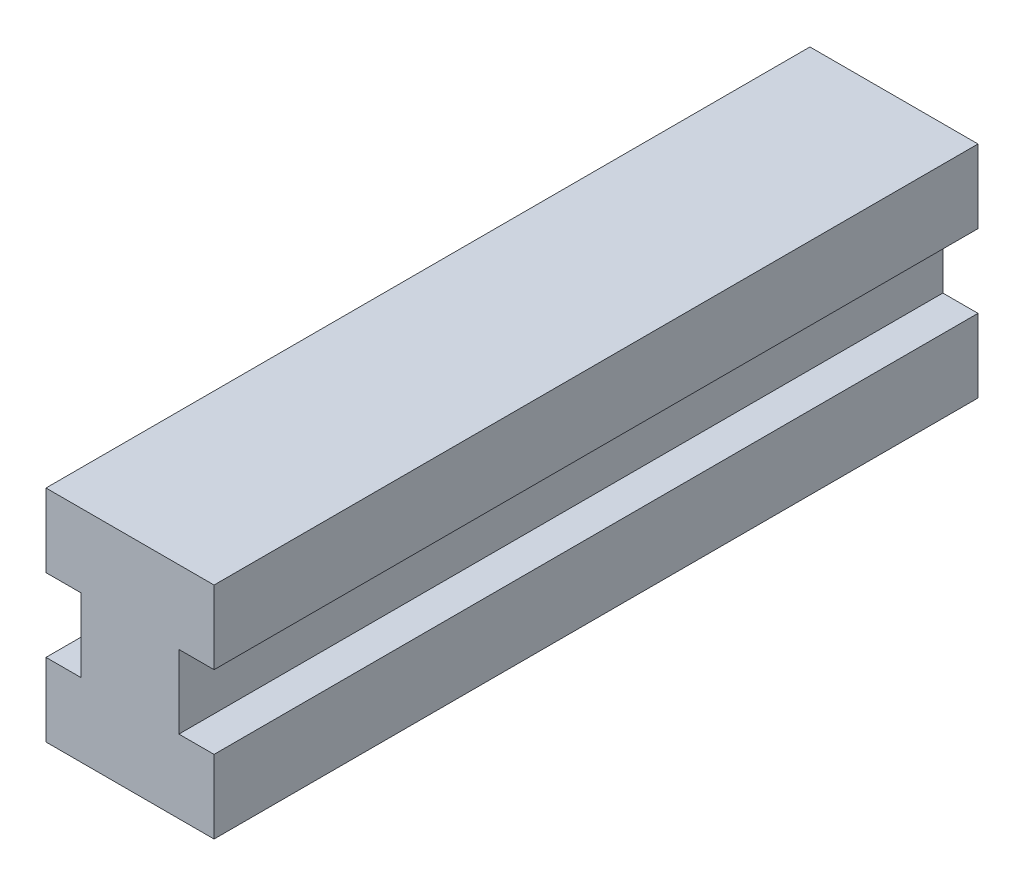
ISO-10303-21;
HEADER;
FILE_DESCRIPTION(('STEP AP214'),'2;1');
FILE_NAME('part.step','',(''),(''),'','','');
FILE_SCHEMA(('AUTOMOTIVE_DESIGN { 1 0 10303 214 1 1 1 1 }'));
ENDSEC;
DATA;
#1=APPLICATION_CONTEXT('core data for automotive mechanical design processes');
#2=APPLICATION_PROTOCOL_DEFINITION('international standard','automotive_design',2000,#1);
#3=PRODUCT_CONTEXT('',#1,'mechanical');
#4=PRODUCT('Part','Part','',(#3));
#5=PRODUCT_RELATED_PRODUCT_CATEGORY('part','',(#4));
#6=PRODUCT_DEFINITION_FORMATION('','',#4);
#7=PRODUCT_DEFINITION_CONTEXT('part definition',#1,'design');
#8=PRODUCT_DEFINITION('design','',#6,#7);
#9=PRODUCT_DEFINITION_SHAPE('','',#8);
#10=(LENGTH_UNIT() NAMED_UNIT(*) SI_UNIT(.MILLI.,.METRE.));
#11=(NAMED_UNIT(*) PLANE_ANGLE_UNIT() SI_UNIT($,.RADIAN.));
#12=(NAMED_UNIT(*) SI_UNIT($,.STERADIAN.) SOLID_ANGLE_UNIT());
#13=UNCERTAINTY_MEASURE_WITH_UNIT(LENGTH_MEASURE(1.E-05),#10,'distance_accuracy_value','');
#14=(GEOMETRIC_REPRESENTATION_CONTEXT(3) GLOBAL_UNCERTAINTY_ASSIGNED_CONTEXT((#13)) GLOBAL_UNIT_ASSIGNED_CONTEXT((#10,
#11,#12)) REPRESENTATION_CONTEXT('',''));
#15=CARTESIAN_POINT('',(0.,0.,0.));
#16=DIRECTION('',(0.,0.,1.));
#17=DIRECTION('',(1.,0.,0.));
#18=AXIS2_PLACEMENT_3D('',#15,#16,#17);
#19=CARTESIAN_POINT('',(-1.6,2.4,25.));
#20=DIRECTION('',(0.,-1.,0.));
#21=DIRECTION('',(0.,0.,-1.));
#22=AXIS2_PLACEMENT_3D('',#19,#20,#21);
#23=PLANE('',#22);
#24=DIRECTION('',(-1.,0.,0.));
#25=VECTOR('',#24,1.);
#26=CARTESIAN_POINT('',(-1.6,2.4,0.));
#27=LINE('',#26,#25);
#28=CARTESIAN_POINT('',(-1.6,2.4,0.));
#29=VERTEX_POINT('',#28);
#30=CARTESIAN_POINT('',(-2.75,2.4,0.));
#31=VERTEX_POINT('',#30);
#32=EDGE_CURVE('E156',#29,#31,#27,.T.);
#33=ORIENTED_EDGE('',*,*,#32,.T.);
#34=DIRECTION('',(0.,0.,-1.));
#35=VECTOR('',#34,1.);
#36=CARTESIAN_POINT('',(-2.75,2.4,25.));
#37=LINE('',#36,#35);
#38=CARTESIAN_POINT('',(-2.75,2.4,25.));
#39=VERTEX_POINT('',#38);
#40=EDGE_CURVE('E11',#39,#31,#37,.T.);
#41=ORIENTED_EDGE('',*,*,#40,.F.);
#42=DIRECTION('',(-1.,0.,0.));
#43=VECTOR('',#42,1.);
#44=CARTESIAN_POINT('',(-1.6,2.4,25.));
#45=LINE('',#44,#43);
#46=CARTESIAN_POINT('',(-1.6,2.4,25.));
#47=VERTEX_POINT('',#46);
#48=EDGE_CURVE('E178',#47,#39,#45,.T.);
#49=ORIENTED_EDGE('',*,*,#48,.F.);
#50=DIRECTION('',(0.,0.,-1.));
#51=VECTOR('',#50,1.);
#52=CARTESIAN_POINT('',(-1.6,2.4,25.));
#53=LINE('',#52,#51);
#54=EDGE_CURVE('E152',#47,#29,#53,.T.);
#55=ORIENTED_EDGE('',*,*,#54,.T.);
#56=EDGE_LOOP('',(#33,#41,#49,#55));
#57=FACE_BOUND('',#56,.T.);
#58=ADVANCED_FACE('F36',(#57),#23,.F.);
#59=CARTESIAN_POINT('',(-2.75,0.,25.));
#60=DIRECTION('',(1.,0.,0.));
#61=DIRECTION('',(0.,0.,-1.));
#62=AXIS2_PLACEMENT_3D('',#59,#60,#61);
#63=PLANE('',#62);
#64=DIRECTION('',(0.,-1.,0.));
#65=VECTOR('',#64,1.);
#66=CARTESIAN_POINT('',(-2.75,0.,0.));
#67=LINE('',#66,#65);
#68=CARTESIAN_POINT('',(-2.75,0.,0.));
#69=VERTEX_POINT('',#68);
#70=EDGE_CURVE('E159',#31,#69,#67,.T.);
#71=ORIENTED_EDGE('',*,*,#70,.T.);
#72=DIRECTION('',(0.,0.,-1.));
#73=VECTOR('',#72,1.);
#74=CARTESIAN_POINT('',(-2.75,0.,25.));
#75=LINE('',#74,#73);
#76=CARTESIAN_POINT('',(-2.75,0.,25.));
#77=VERTEX_POINT('',#76);
#78=EDGE_CURVE('E44',#77,#69,#75,.T.);
#79=ORIENTED_EDGE('',*,*,#78,.F.);
#80=DIRECTION('',(0.,-1.,0.));
#81=VECTOR('',#80,1.);
#82=CARTESIAN_POINT('',(-2.75,0.,25.));
#83=LINE('',#82,#81);
#84=EDGE_CURVE('E107',#39,#77,#83,.T.);
#85=ORIENTED_EDGE('',*,*,#84,.F.);
#86=ORIENTED_EDGE('',*,*,#40,.T.);
#87=EDGE_LOOP('',(#71,#79,#85,#86));
#88=FACE_BOUND('',#87,.T.);
#89=ADVANCED_FACE('F256',(#88),#63,.F.);
#90=CARTESIAN_POINT('',(-2.75,0.,25.));
#91=DIRECTION('',(0.,1.,0.));
#92=DIRECTION('',(-1.,0.,0.));
#93=AXIS2_PLACEMENT_3D('',#90,#91,#92);
#94=PLANE('',#93);
#95=DIRECTION('',(1.,0.,0.));
#96=VECTOR('',#95,1.);
#97=CARTESIAN_POINT('',(-2.75,0.,0.));
#98=LINE('',#97,#96);
#99=CARTESIAN_POINT('',(2.75,0.,0.));
#100=VERTEX_POINT('',#99);
#101=EDGE_CURVE('E161',#69,#100,#98,.T.);
#102=ORIENTED_EDGE('',*,*,#101,.T.);
#103=DIRECTION('',(0.,0.,-1.));
#104=VECTOR('',#103,1.);
#105=CARTESIAN_POINT('',(2.75,0.,25.));
#106=LINE('',#105,#104);
#107=CARTESIAN_POINT('',(2.75,0.,25.));
#108=VERTEX_POINT('',#107);
#109=EDGE_CURVE('E197',#108,#100,#106,.T.);
#110=ORIENTED_EDGE('',*,*,#109,.F.);
#111=DIRECTION('',(1.,0.,0.));
#112=VECTOR('',#111,1.);
#113=CARTESIAN_POINT('',(-2.75,0.,25.));
#114=LINE('',#113,#112);
#115=EDGE_CURVE('E205',#77,#108,#114,.T.);
#116=ORIENTED_EDGE('',*,*,#115,.F.);
#117=ORIENTED_EDGE('',*,*,#78,.T.);
#118=EDGE_LOOP('',(#102,#110,#116,#117));
#119=FACE_BOUND('',#118,.T.);
#120=ADVANCED_FACE('F203',(#119),#94,.F.);
#121=CARTESIAN_POINT('',(2.75,0.,25.));
#122=DIRECTION('',(-1.,0.,0.));
#123=DIRECTION('',(0.,0.,1.));
#124=AXIS2_PLACEMENT_3D('',#121,#122,#123);
#125=PLANE('',#124);
#126=DIRECTION('',(0.,1.,0.));
#127=VECTOR('',#126,1.);
#128=CARTESIAN_POINT('',(2.75,0.,0.));
#129=LINE('',#128,#127);
#130=CARTESIAN_POINT('',(2.75,2.4,0.));
#131=VERTEX_POINT('',#130);
#132=EDGE_CURVE('E163',#100,#131,#129,.T.);
#133=ORIENTED_EDGE('',*,*,#132,.T.);
#134=DIRECTION('',(0.,0.,-1.));
#135=VECTOR('',#134,1.);
#136=CARTESIAN_POINT('',(2.75,2.4,25.));
#137=LINE('',#136,#135);
#138=CARTESIAN_POINT('',(2.75,2.4,25.));
#139=VERTEX_POINT('',#138);
#140=EDGE_CURVE('E194',#139,#131,#137,.T.);
#141=ORIENTED_EDGE('',*,*,#140,.F.);
#142=DIRECTION('',(0.,1.,0.));
#143=VECTOR('',#142,1.);
#144=CARTESIAN_POINT('',(2.75,0.,25.));
#145=LINE('',#144,#143);
#146=EDGE_CURVE('E223',#108,#139,#145,.T.);
#147=ORIENTED_EDGE('',*,*,#146,.F.);
#148=ORIENTED_EDGE('',*,*,#109,.T.);
#149=EDGE_LOOP('',(#133,#141,#147,#148));
#150=FACE_BOUND('',#149,.T.);
#151=ADVANCED_FACE('F214',(#150),#125,.F.);
#152=CARTESIAN_POINT('',(2.75,2.4,25.));
#153=DIRECTION('',(0.,-1.,0.));
#154=DIRECTION('',(0.,0.,-1.));
#155=AXIS2_PLACEMENT_3D('',#152,#153,#154);
#156=PLANE('',#155);
#157=DIRECTION('',(-1.,0.,0.));
#158=VECTOR('',#157,1.);
#159=CARTESIAN_POINT('',(2.75,2.4,0.));
#160=LINE('',#159,#158);
#161=CARTESIAN_POINT('',(1.6,2.4,0.));
#162=VERTEX_POINT('',#161);
#163=EDGE_CURVE('E165',#131,#162,#160,.T.);
#164=ORIENTED_EDGE('',*,*,#163,.T.);
#165=DIRECTION('',(0.,0.,-1.));
#166=VECTOR('',#165,1.);
#167=CARTESIAN_POINT('',(1.6,2.4,25.));
#168=LINE('',#167,#166);
#169=CARTESIAN_POINT('',(1.6,2.4,25.));
#170=VERTEX_POINT('',#169);
#171=EDGE_CURVE('E191',#170,#162,#168,.T.);
#172=ORIENTED_EDGE('',*,*,#171,.F.);
#173=DIRECTION('',(-1.,0.,0.));
#174=VECTOR('',#173,1.);
#175=CARTESIAN_POINT('',(2.75,2.4,25.));
#176=LINE('',#175,#174);
#177=EDGE_CURVE('E220',#139,#170,#176,.T.);
#178=ORIENTED_EDGE('',*,*,#177,.F.);
#179=ORIENTED_EDGE('',*,*,#140,.T.);
#180=EDGE_LOOP('',(#164,#172,#178,#179));
#181=FACE_BOUND('',#180,.T.);
#182=ADVANCED_FACE('F218',(#181),#156,.F.);
#183=CARTESIAN_POINT('',(1.6,4.8,25.));
#184=DIRECTION('',(-1.,0.,0.));
#185=DIRECTION('',(0.,0.,1.));
#186=AXIS2_PLACEMENT_3D('',#183,#184,#185);
#187=PLANE('',#186);
#188=DIRECTION('',(0.,1.,0.));
#189=VECTOR('',#188,1.);
#190=CARTESIAN_POINT('',(1.6,4.8,0.));
#191=LINE('',#190,#189);
#192=CARTESIAN_POINT('',(1.6,4.8,0.));
#193=VERTEX_POINT('',#192);
#194=EDGE_CURVE('E167',#162,#193,#191,.T.);
#195=ORIENTED_EDGE('',*,*,#194,.T.);
#196=DIRECTION('',(0.,0.,-1.));
#197=VECTOR('',#196,1.);
#198=CARTESIAN_POINT('',(1.6,4.8,25.));
#199=LINE('',#198,#197);
#200=CARTESIAN_POINT('',(1.6,4.8,25.));
#201=VERTEX_POINT('',#200);
#202=EDGE_CURVE('E188',#201,#193,#199,.T.);
#203=ORIENTED_EDGE('',*,*,#202,.F.);
#204=DIRECTION('',(0.,1.,0.));
#205=VECTOR('',#204,1.);
#206=CARTESIAN_POINT('',(1.6,4.8,25.));
#207=LINE('',#206,#205);
#208=EDGE_CURVE('E222',#170,#201,#207,.T.);
#209=ORIENTED_EDGE('',*,*,#208,.F.);
#210=ORIENTED_EDGE('',*,*,#171,.T.);
#211=EDGE_LOOP('',(#195,#203,#209,#210));
#212=FACE_BOUND('',#211,.T.);
#213=ADVANCED_FACE('F269',(#212),#187,.F.);
#214=CARTESIAN_POINT('',(1.6,4.8,25.));
#215=DIRECTION('',(0.,1.,0.));
#216=DIRECTION('',(0.,0.,1.));
#217=AXIS2_PLACEMENT_3D('',#214,#215,#216);
#218=PLANE('',#217);
#219=DIRECTION('',(1.,0.,0.));
#220=VECTOR('',#219,1.);
#221=CARTESIAN_POINT('',(1.6,4.8,0.));
#222=LINE('',#221,#220);
#223=CARTESIAN_POINT('',(2.75,4.8,0.));
#224=VERTEX_POINT('',#223);
#225=EDGE_CURVE('E169',#193,#224,#222,.T.);
#226=ORIENTED_EDGE('',*,*,#225,.T.);
#227=DIRECTION('',(0.,0.,-1.));
#228=VECTOR('',#227,1.);
#229=CARTESIAN_POINT('',(2.75,4.8,25.));
#230=LINE('',#229,#228);
#231=CARTESIAN_POINT('',(2.75,4.8,25.));
#232=VERTEX_POINT('',#231);
#233=EDGE_CURVE('E185',#232,#224,#230,.T.);
#234=ORIENTED_EDGE('',*,*,#233,.F.);
#235=DIRECTION('',(1.,0.,0.));
#236=VECTOR('',#235,1.);
#237=CARTESIAN_POINT('',(1.6,4.8,25.));
#238=LINE('',#237,#236);
#239=EDGE_CURVE('E225',#201,#232,#238,.T.);
#240=ORIENTED_EDGE('',*,*,#239,.F.);
#241=ORIENTED_EDGE('',*,*,#202,.T.);
#242=EDGE_LOOP('',(#226,#234,#240,#241));
#243=FACE_BOUND('',#242,.T.);
#244=ADVANCED_FACE('F272',(#243),#218,.F.);
#245=CARTESIAN_POINT('',(2.75,7.2,25.));
#246=DIRECTION('',(-1.,0.,0.));
#247=DIRECTION('',(0.,0.,1.));
#248=AXIS2_PLACEMENT_3D('',#245,#246,#247);
#249=PLANE('',#248);
#250=DIRECTION('',(0.,1.,0.));
#251=VECTOR('',#250,1.);
#252=CARTESIAN_POINT('',(2.75,7.2,0.));
#253=LINE('',#252,#251);
#254=CARTESIAN_POINT('',(2.75,7.2,0.));
#255=VERTEX_POINT('',#254);
#256=EDGE_CURVE('E171',#224,#255,#253,.T.);
#257=ORIENTED_EDGE('',*,*,#256,.T.);
#258=DIRECTION('',(0.,0.,-1.));
#259=VECTOR('',#258,1.);
#260=CARTESIAN_POINT('',(2.75,7.2,25.));
#261=LINE('',#260,#259);
#262=CARTESIAN_POINT('',(2.75,7.2,25.));
#263=VERTEX_POINT('',#262);
#264=EDGE_CURVE('E182',#263,#255,#261,.T.);
#265=ORIENTED_EDGE('',*,*,#264,.F.);
#266=DIRECTION('',(0.,1.,0.));
#267=VECTOR('',#266,1.);
#268=CARTESIAN_POINT('',(2.75,7.2,25.));
#269=LINE('',#268,#267);
#270=EDGE_CURVE('E231',#232,#263,#269,.T.);
#271=ORIENTED_EDGE('',*,*,#270,.F.);
#272=ORIENTED_EDGE('',*,*,#233,.T.);
#273=EDGE_LOOP('',(#257,#265,#271,#272));
#274=FACE_BOUND('',#273,.T.);
#275=ADVANCED_FACE('F237',(#274),#249,.F.);
#276=CARTESIAN_POINT('',(-2.75,7.2,25.));
#277=DIRECTION('',(0.,-1.,0.));
#278=DIRECTION('',(0.,0.,-1.));
#279=AXIS2_PLACEMENT_3D('',#276,#277,#278);
#280=PLANE('',#279);
#281=DIRECTION('',(-1.,0.,0.));
#282=VECTOR('',#281,1.);
#283=CARTESIAN_POINT('',(-2.75,7.2,0.));
#284=LINE('',#283,#282);
#285=CARTESIAN_POINT('',(-2.75,7.2,0.));
#286=VERTEX_POINT('',#285);
#287=EDGE_CURVE('E173',#255,#286,#284,.T.);
#288=ORIENTED_EDGE('',*,*,#287,.T.);
#289=DIRECTION('',(0.,0.,-1.));
#290=VECTOR('',#289,1.);
#291=CARTESIAN_POINT('',(-2.75,7.2,25.));
#292=LINE('',#291,#290);
#293=CARTESIAN_POINT('',(-2.75,7.2,25.));
#294=VERTEX_POINT('',#293);
#295=EDGE_CURVE('E147',#294,#286,#292,.T.);
#296=ORIENTED_EDGE('',*,*,#295,.F.);
#297=DIRECTION('',(-1.,0.,0.));
#298=VECTOR('',#297,1.);
#299=CARTESIAN_POINT('',(-2.75,7.2,25.));
#300=LINE('',#299,#298);
#301=EDGE_CURVE('E138',#263,#294,#300,.T.);
#302=ORIENTED_EDGE('',*,*,#301,.F.);
#303=ORIENTED_EDGE('',*,*,#264,.T.);
#304=EDGE_LOOP('',(#288,#296,#302,#303));
#305=FACE_BOUND('',#304,.T.);
#306=ADVANCED_FACE('F241',(#305),#280,.F.);
#307=CARTESIAN_POINT('',(-2.75,7.2,25.));
#308=DIRECTION('',(1.,0.,0.));
#309=DIRECTION('',(0.,0.,-1.));
#310=AXIS2_PLACEMENT_3D('',#307,#308,#309);
#311=PLANE('',#310);
#312=DIRECTION('',(0.,-1.,0.));
#313=VECTOR('',#312,1.);
#314=CARTESIAN_POINT('',(-2.75,7.2,0.));
#315=LINE('',#314,#313);
#316=CARTESIAN_POINT('',(-2.75,4.8,0.));
#317=VERTEX_POINT('',#316);
#318=EDGE_CURVE('E146',#286,#317,#315,.T.);
#319=ORIENTED_EDGE('',*,*,#318,.T.);
#320=DIRECTION('',(0.,0.,-1.));
#321=VECTOR('',#320,1.);
#322=CARTESIAN_POINT('',(-2.75,4.8,25.));
#323=LINE('',#322,#321);
#324=CARTESIAN_POINT('',(-2.75,4.8,25.));
#325=VERTEX_POINT('',#324);
#326=EDGE_CURVE('E143',#325,#317,#323,.T.);
#327=ORIENTED_EDGE('',*,*,#326,.F.);
#328=DIRECTION('',(0.,-1.,0.));
#329=VECTOR('',#328,1.);
#330=CARTESIAN_POINT('',(-2.75,7.2,25.));
#331=LINE('',#330,#329);
#332=EDGE_CURVE('E132',#294,#325,#331,.T.);
#333=ORIENTED_EDGE('',*,*,#332,.F.);
#334=ORIENTED_EDGE('',*,*,#295,.T.);
#335=EDGE_LOOP('',(#319,#327,#333,#334));
#336=FACE_BOUND('',#335,.T.);
#337=ADVANCED_FACE('F144',(#336),#311,.F.);
#338=CARTESIAN_POINT('',(-2.75,4.8,25.));
#339=DIRECTION('',(0.,1.,0.));
#340=DIRECTION('',(0.,0.,1.));
#341=AXIS2_PLACEMENT_3D('',#338,#339,#340);
#342=PLANE('',#341);
#343=DIRECTION('',(1.,0.,0.));
#344=VECTOR('',#343,1.);
#345=CARTESIAN_POINT('',(-2.75,4.8,0.));
#346=LINE('',#345,#344);
#347=CARTESIAN_POINT('',(-1.6,4.8,0.));
#348=VERTEX_POINT('',#347);
#349=EDGE_CURVE('E93',#317,#348,#346,.T.);
#350=ORIENTED_EDGE('',*,*,#349,.T.);
#351=DIRECTION('',(0.,0.,-1.));
#352=VECTOR('',#351,1.);
#353=CARTESIAN_POINT('',(-1.6,4.8,25.));
#354=LINE('',#353,#352);
#355=CARTESIAN_POINT('',(-1.6,4.8,25.));
#356=VERTEX_POINT('',#355);
#357=EDGE_CURVE('E148',#356,#348,#354,.T.);
#358=ORIENTED_EDGE('',*,*,#357,.F.);
#359=DIRECTION('',(1.,0.,0.));
#360=VECTOR('',#359,1.);
#361=CARTESIAN_POINT('',(-2.75,4.8,25.));
#362=LINE('',#361,#360);
#363=EDGE_CURVE('E136',#325,#356,#362,.T.);
#364=ORIENTED_EDGE('',*,*,#363,.F.);
#365=ORIENTED_EDGE('',*,*,#326,.T.);
#366=EDGE_LOOP('',(#350,#358,#364,#365));
#367=FACE_BOUND('',#366,.T.);
#368=ADVANCED_FACE('F150',(#367),#342,.F.);
#369=CARTESIAN_POINT('',(-1.6,4.8,25.));
#370=DIRECTION('',(1.,0.,0.));
#371=DIRECTION('',(0.,0.,-1.));
#372=AXIS2_PLACEMENT_3D('',#369,#370,#371);
#373=PLANE('',#372);
#374=DIRECTION('',(0.,-1.,0.));
#375=VECTOR('',#374,1.);
#376=CARTESIAN_POINT('',(-1.6,4.8,0.));
#377=LINE('',#376,#375);
#378=EDGE_CURVE('E99',#348,#29,#377,.T.);
#379=ORIENTED_EDGE('',*,*,#378,.T.);
#380=ORIENTED_EDGE('',*,*,#54,.F.);
#381=DIRECTION('',(0.,-1.,0.));
#382=VECTOR('',#381,1.);
#383=CARTESIAN_POINT('',(-1.6,4.8,25.));
#384=LINE('',#383,#382);
#385=EDGE_CURVE('E52',#356,#47,#384,.T.);
#386=ORIENTED_EDGE('',*,*,#385,.F.);
#387=ORIENTED_EDGE('',*,*,#357,.T.);
#388=EDGE_LOOP('',(#379,#380,#386,#387));
#389=FACE_BOUND('',#388,.T.);
#390=ADVANCED_FACE('F245',(#389),#373,.F.);
#391=CARTESIAN_POINT('',(0.,0.,25.));
#392=DIRECTION('',(0.,0.,-1.));
#393=DIRECTION('',(-1.,0.,0.));
#394=AXIS2_PLACEMENT_3D('',#391,#392,#393);
#395=PLANE('',#394);
#396=ORIENTED_EDGE('',*,*,#48,.T.);
#397=ORIENTED_EDGE('',*,*,#84,.T.);
#398=ORIENTED_EDGE('',*,*,#115,.T.);
#399=ORIENTED_EDGE('',*,*,#146,.T.);
#400=ORIENTED_EDGE('',*,*,#177,.T.);
#401=ORIENTED_EDGE('',*,*,#208,.T.);
#402=ORIENTED_EDGE('',*,*,#239,.T.);
#403=ORIENTED_EDGE('',*,*,#270,.T.);
#404=ORIENTED_EDGE('',*,*,#301,.T.);
#405=ORIENTED_EDGE('',*,*,#332,.T.);
#406=ORIENTED_EDGE('',*,*,#363,.T.);
#407=ORIENTED_EDGE('',*,*,#385,.T.);
#408=EDGE_LOOP('',(#396,#397,#398,#399,#400,#401,#402,#403,#404,#405,#406,#407));
#409=FACE_BOUND('',#408,.T.);
#410=ADVANCED_FACE('F134',(#409),#395,.F.);
#411=CARTESIAN_POINT('',(0.,0.,0.));
#412=DIRECTION('',(0.,0.,-1.));
#413=DIRECTION('',(-1.,0.,0.));
#414=AXIS2_PLACEMENT_3D('',#411,#412,#413);
#415=PLANE('',#414);
#416=ORIENTED_EDGE('',*,*,#32,.F.);
#417=ORIENTED_EDGE('',*,*,#378,.F.);
#418=ORIENTED_EDGE('',*,*,#349,.F.);
#419=ORIENTED_EDGE('',*,*,#318,.F.);
#420=ORIENTED_EDGE('',*,*,#287,.F.);
#421=ORIENTED_EDGE('',*,*,#256,.F.);
#422=ORIENTED_EDGE('',*,*,#225,.F.);
#423=ORIENTED_EDGE('',*,*,#194,.F.);
#424=ORIENTED_EDGE('',*,*,#163,.F.);
#425=ORIENTED_EDGE('',*,*,#132,.F.);
#426=ORIENTED_EDGE('',*,*,#101,.F.);
#427=ORIENTED_EDGE('',*,*,#70,.F.);
#428=EDGE_LOOP('',(#416,#417,#418,#419,#420,#421,#422,#423,#424,#425,#426,#427));
#429=FACE_BOUND('',#428,.T.);
#430=ADVANCED_FACE('F209',(#429),#415,.T.);
#431=CLOSED_SHELL('',(#58,#89,#120,#151,#182,#213,#244,#275,#306,#337,#368,#390,#410,#430));
#432=MANIFOLD_SOLID_BREP('B2',#431);
#433=ADVANCED_BREP_SHAPE_REPRESENTATION('',(#18,#432),#14);
#434=SHAPE_DEFINITION_REPRESENTATION(#9,#433);
ENDSEC;
END-ISO-10303-21;
